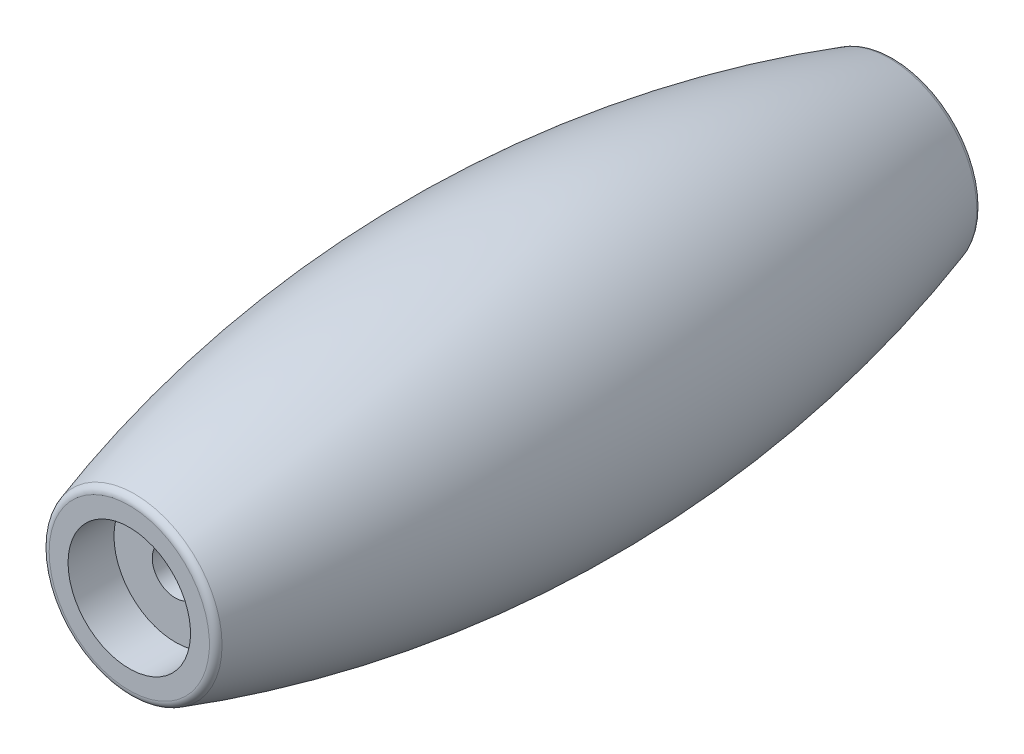
ISO-10303-21;
HEADER;
FILE_DESCRIPTION(('STEP AP214'),'2;1');
FILE_NAME('part.step','',(''),(''),'','','');
FILE_SCHEMA(('AUTOMOTIVE_DESIGN { 1 0 10303 214 1 1 1 1 }'));
ENDSEC;
DATA;
#1=APPLICATION_CONTEXT('core data for automotive mechanical design processes');
#2=APPLICATION_PROTOCOL_DEFINITION('international standard','automotive_design',2000,#1);
#3=PRODUCT_CONTEXT('',#1,'mechanical');
#4=PRODUCT('Part','Part','',(#3));
#5=PRODUCT_RELATED_PRODUCT_CATEGORY('part','',(#4));
#6=PRODUCT_DEFINITION_FORMATION('','',#4);
#7=PRODUCT_DEFINITION_CONTEXT('part definition',#1,'design');
#8=PRODUCT_DEFINITION('design','',#6,#7);
#9=PRODUCT_DEFINITION_SHAPE('','',#8);
#10=(LENGTH_UNIT() NAMED_UNIT(*) SI_UNIT(.MILLI.,.METRE.));
#11=(NAMED_UNIT(*) PLANE_ANGLE_UNIT() SI_UNIT($,.RADIAN.));
#12=(NAMED_UNIT(*) SI_UNIT($,.STERADIAN.) SOLID_ANGLE_UNIT());
#13=UNCERTAINTY_MEASURE_WITH_UNIT(LENGTH_MEASURE(1.E-05),#10,'distance_accuracy_value','');
#14=(GEOMETRIC_REPRESENTATION_CONTEXT(3) GLOBAL_UNCERTAINTY_ASSIGNED_CONTEXT((#13)) GLOBAL_UNIT_ASSIGNED_CONTEXT((#10,
#11,#12)) REPRESENTATION_CONTEXT('',''));
#15=CARTESIAN_POINT('',(0.,0.,0.));
#16=DIRECTION('',(0.,0.,1.));
#17=DIRECTION('',(1.,0.,0.));
#18=AXIS2_PLACEMENT_3D('',#15,#16,#17);
#19=CARTESIAN_POINT('',(0.,0.,11.2812850808932));
#20=DIRECTION('',(0.,0.,-1.));
#21=DIRECTION('',(-1.,0.,0.));
#22=AXIS2_PLACEMENT_3D('',#19,#20,#21);
#23=DEGENERATE_TOROIDAL_SURFACE('',#22,72.5782051282051,82.0782051282051,.F.);
#24=CARTESIAN_POINT('',(0.,0.,35.93144773746));
#25=DIRECTION('',(0.,0.,-1.));
#26=DIRECTION('',(-1.,0.,0.));
#27=AXIS2_PLACEMENT_3D('',#24,#25,#26);
#28=CIRCLE('',#27,5.71101020872694);
#29=CARTESIAN_POINT('',(-5.71101020872694,0.,35.93144773746));
#30=VERTEX_POINT('',#29);
#31=EDGE_CURVE('E43',#30,#30,#28,.T.);
#32=ORIENTED_EDGE('',*,*,#31,.T.);
#33=EDGE_LOOP('',(#32));
#34=FACE_BOUND('',#33,.T.);
#35=CARTESIAN_POINT('',(0.,0.,-13.3688775756736));
#36=DIRECTION('',(0.,0.,1.));
#37=DIRECTION('',(1.,0.,0.));
#38=AXIS2_PLACEMENT_3D('',#35,#36,#37);
#39=CIRCLE('',#38,5.71101020872694);
#40=CARTESIAN_POINT('',(5.71101020872694,0.,-13.3688775756736));
#41=VERTEX_POINT('',#40);
#42=EDGE_CURVE('E47',#41,#41,#39,.T.);
#43=ORIENTED_EDGE('',*,*,#42,.T.);
#44=EDGE_LOOP('',(#43));
#45=FACE_BOUND('',#44,.T.);
#46=ADVANCED_FACE('F32',(#34,#45),#23,.F.);
#47=CARTESIAN_POINT('',(4.00000000000001,0.,36.2812850808932));
#48=DIRECTION('',(0.,0.,-1.));
#49=DIRECTION('',(-1.,0.,0.));
#50=AXIS2_PLACEMENT_3D('',#47,#48,#49);
#51=PLANE('',#50);
#52=CARTESIAN_POINT('',(0.,0.,36.2812850808932));
#53=DIRECTION('',(0.,0.,-1.));
#54=DIRECTION('',(-1.,0.,0.));
#55=AXIS2_PLACEMENT_3D('',#52,#53,#54);
#56=CIRCLE('',#55,5.23409179162312);
#57=CARTESIAN_POINT('',(-5.23409179162312,0.,36.2812850808932));
#58=VERTEX_POINT('',#57);
#59=EDGE_CURVE('E39',#58,#58,#56,.F.);
#60=ORIENTED_EDGE('',*,*,#59,.T.);
#61=EDGE_LOOP('',(#60));
#62=FACE_BOUND('',#61,.T.);
#63=CARTESIAN_POINT('',(0.,0.,36.2812850808932));
#64=DIRECTION('',(0.,0.,-1.));
#65=DIRECTION('',(-1.,0.,0.));
#66=AXIS2_PLACEMENT_3D('',#63,#64,#65);
#67=CIRCLE('',#66,4.);
#68=CARTESIAN_POINT('',(-3.99999999999999,0.,36.2812850808932));
#69=VERTEX_POINT('',#68);
#70=EDGE_CURVE('E52',#69,#69,#67,.T.);
#71=ORIENTED_EDGE('',*,*,#70,.T.);
#72=EDGE_LOOP('',(#71));
#73=FACE_BOUND('',#72,.T.);
#74=ADVANCED_FACE('F89',(#62,#73),#51,.F.);
#75=CARTESIAN_POINT('',(0.,0.,-10.7187149191068));
#76=DIRECTION('',(0.,0.,-1.));
#77=DIRECTION('',(-1.,0.,0.));
#78=AXIS2_PLACEMENT_3D('',#75,#76,#77);
#79=CYLINDRICAL_SURFACE('',#78,4.);
#80=ORIENTED_EDGE('',*,*,#70,.F.);
#81=EDGE_LOOP('',(#80));
#82=FACE_BOUND('',#81,.T.);
#83=CARTESIAN_POINT('',(0.,0.,33.2812850808932));
#84=DIRECTION('',(0.,0.,-1.));
#85=DIRECTION('',(-1.,0.,0.));
#86=AXIS2_PLACEMENT_3D('',#83,#84,#85);
#87=CIRCLE('',#86,4.);
#88=CARTESIAN_POINT('',(-4.,0.,33.2812850808932));
#89=VERTEX_POINT('',#88);
#90=EDGE_CURVE('E59',#89,#89,#87,.T.);
#91=ORIENTED_EDGE('',*,*,#90,.T.);
#92=EDGE_LOOP('',(#91));
#93=FACE_BOUND('',#92,.T.);
#94=ADVANCED_FACE('F95',(#82,#93),#79,.F.);
#95=CARTESIAN_POINT('',(4.00000000000001,0.,33.2812850808932));
#96=DIRECTION('',(0.,0.,-1.));
#97=DIRECTION('',(-1.,0.,0.));
#98=AXIS2_PLACEMENT_3D('',#95,#96,#97);
#99=PLANE('',#98);
#100=CARTESIAN_POINT('',(0.,0.,33.2812850808932));
#101=DIRECTION('',(0.,0.,-1.));
#102=DIRECTION('',(-1.,0.,0.));
#103=AXIS2_PLACEMENT_3D('',#100,#101,#102);
#104=CIRCLE('',#103,1.5);
#105=CARTESIAN_POINT('',(-1.5,0.,33.2812850808932));
#106=VERTEX_POINT('',#105);
#107=EDGE_CURVE('E56',#106,#106,#104,.T.);
#108=ORIENTED_EDGE('',*,*,#107,.T.);
#109=EDGE_LOOP('',(#108));
#110=FACE_BOUND('',#109,.T.);
#111=ORIENTED_EDGE('',*,*,#90,.F.);
#112=EDGE_LOOP('',(#111));
#113=FACE_BOUND('',#112,.T.);
#114=ADVANCED_FACE('F71',(#110,#113),#99,.F.);
#115=CARTESIAN_POINT('',(4.,0.,-10.7187149191068));
#116=DIRECTION('',(0.,0.,1.));
#117=DIRECTION('',(1.,0.,0.));
#118=AXIS2_PLACEMENT_3D('',#115,#116,#117);
#119=PLANE('',#118);
#120=CARTESIAN_POINT('',(0.,0.,-10.7187149191068));
#121=DIRECTION('',(0.,0.,1.));
#122=DIRECTION('',(1.,0.,0.));
#123=AXIS2_PLACEMENT_3D('',#120,#121,#122);
#124=CIRCLE('',#123,1.5);
#125=CARTESIAN_POINT('',(1.5,0.,-10.7187149191068));
#126=VERTEX_POINT('',#125);
#127=EDGE_CURVE('E53',#126,#126,#124,.T.);
#128=ORIENTED_EDGE('',*,*,#127,.T.);
#129=EDGE_LOOP('',(#128));
#130=FACE_BOUND('',#129,.T.);
#131=CARTESIAN_POINT('',(0.,0.,-10.7187149191068));
#132=DIRECTION('',(0.,0.,-1.));
#133=DIRECTION('',(-1.,0.,0.));
#134=AXIS2_PLACEMENT_3D('',#131,#132,#133);
#135=CIRCLE('',#134,4.);
#136=CARTESIAN_POINT('',(-4.,0.,-10.7187149191068));
#137=VERTEX_POINT('',#136);
#138=EDGE_CURVE('E62',#137,#137,#135,.T.);
#139=ORIENTED_EDGE('',*,*,#138,.T.);
#140=EDGE_LOOP('',(#139));
#141=FACE_BOUND('',#140,.T.);
#142=ADVANCED_FACE('F104',(#130,#141),#119,.F.);
#143=CARTESIAN_POINT('',(0.,0.,-10.7187149191068));
#144=DIRECTION('',(0.,0.,-1.));
#145=DIRECTION('',(-1.,0.,0.));
#146=AXIS2_PLACEMENT_3D('',#143,#144,#145);
#147=CYLINDRICAL_SURFACE('',#146,4.);
#148=ORIENTED_EDGE('',*,*,#138,.F.);
#149=EDGE_LOOP('',(#148));
#150=FACE_BOUND('',#149,.T.);
#151=CARTESIAN_POINT('',(0.,0.,-13.7187149191068));
#152=DIRECTION('',(0.,0.,-1.));
#153=DIRECTION('',(-1.,0.,0.));
#154=AXIS2_PLACEMENT_3D('',#151,#152,#153);
#155=CIRCLE('',#154,4.);
#156=CARTESIAN_POINT('',(-4.,0.,-13.7187149191068));
#157=VERTEX_POINT('',#156);
#158=EDGE_CURVE('E65',#157,#157,#155,.T.);
#159=ORIENTED_EDGE('',*,*,#158,.T.);
#160=EDGE_LOOP('',(#159));
#161=FACE_BOUND('',#160,.T.);
#162=ADVANCED_FACE('F85',(#150,#161),#147,.F.);
#163=CARTESIAN_POINT('',(4.,0.,-13.7187149191068));
#164=DIRECTION('',(0.,0.,1.));
#165=DIRECTION('',(1.,0.,0.));
#166=AXIS2_PLACEMENT_3D('',#163,#164,#165);
#167=PLANE('',#166);
#168=CARTESIAN_POINT('',(0.,0.,-13.7187149191068));
#169=DIRECTION('',(0.,0.,1.));
#170=DIRECTION('',(1.,0.,0.));
#171=AXIS2_PLACEMENT_3D('',#168,#169,#170);
#172=CIRCLE('',#171,5.23409179162312);
#173=CARTESIAN_POINT('',(5.23409179162312,0.,-13.7187149191068));
#174=VERTEX_POINT('',#173);
#175=EDGE_CURVE('E10',#174,#174,#172,.F.);
#176=ORIENTED_EDGE('',*,*,#175,.T.);
#177=EDGE_LOOP('',(#176));
#178=FACE_BOUND('',#177,.T.);
#179=ORIENTED_EDGE('',*,*,#158,.F.);
#180=EDGE_LOOP('',(#179));
#181=FACE_BOUND('',#180,.T.);
#182=ADVANCED_FACE('F77',(#178,#181),#167,.F.);
#183=CARTESIAN_POINT('',(0.,0.,-13.7187149191068));
#184=DIRECTION('',(0.,0.,1.));
#185=DIRECTION('',(1.,0.,0.));
#186=AXIS2_PLACEMENT_3D('',#183,#184,#185);
#187=CYLINDRICAL_SURFACE('',#186,1.5);
#188=ORIENTED_EDGE('',*,*,#127,.F.);
#189=EDGE_LOOP('',(#188));
#190=FACE_BOUND('',#189,.T.);
#191=ORIENTED_EDGE('',*,*,#107,.F.);
#192=EDGE_LOOP('',(#191));
#193=FACE_BOUND('',#192,.T.);
#194=ADVANCED_FACE('F74',(#190,#193),#187,.F.);
#195=CARTESIAN_POINT('',(0.,0.,35.7812850808932));
#196=DIRECTION('',(0.,0.,-1.));
#197=DIRECTION('',(-1.,0.,0.));
#198=AXIS2_PLACEMENT_3D('',#195,#196,#197);
#199=TOROIDAL_SURFACE('',#198,5.23409179162312,0.5);
#200=ORIENTED_EDGE('',*,*,#59,.F.);
#201=EDGE_LOOP('',(#200));
#202=FACE_BOUND('',#201,.T.);
#203=ORIENTED_EDGE('',*,*,#31,.F.);
#204=EDGE_LOOP('',(#203));
#205=FACE_BOUND('',#204,.T.);
#206=ADVANCED_FACE('F76',(#202,#205),#199,.T.);
#207=CARTESIAN_POINT('',(0.,0.,-13.2187149191068));
#208=DIRECTION('',(0.,0.,1.));
#209=DIRECTION('',(1.,0.,0.));
#210=AXIS2_PLACEMENT_3D('',#207,#208,#209);
#211=TOROIDAL_SURFACE('',#210,5.23409179162312,0.5);
#212=ORIENTED_EDGE('',*,*,#42,.F.);
#213=EDGE_LOOP('',(#212));
#214=FACE_BOUND('',#213,.T.);
#215=ORIENTED_EDGE('',*,*,#175,.F.);
#216=EDGE_LOOP('',(#215));
#217=FACE_BOUND('',#216,.T.);
#218=ADVANCED_FACE('F34',(#214,#217),#211,.T.);
#219=CLOSED_SHELL('',(#46,#74,#94,#114,#142,#162,#182,#194,#206,#218));
#220=MANIFOLD_SOLID_BREP('B2',#219);
#221=ADVANCED_BREP_SHAPE_REPRESENTATION('',(#18,#220),#14);
#222=SHAPE_DEFINITION_REPRESENTATION(#9,#221);
ENDSEC;
END-ISO-10303-21;
